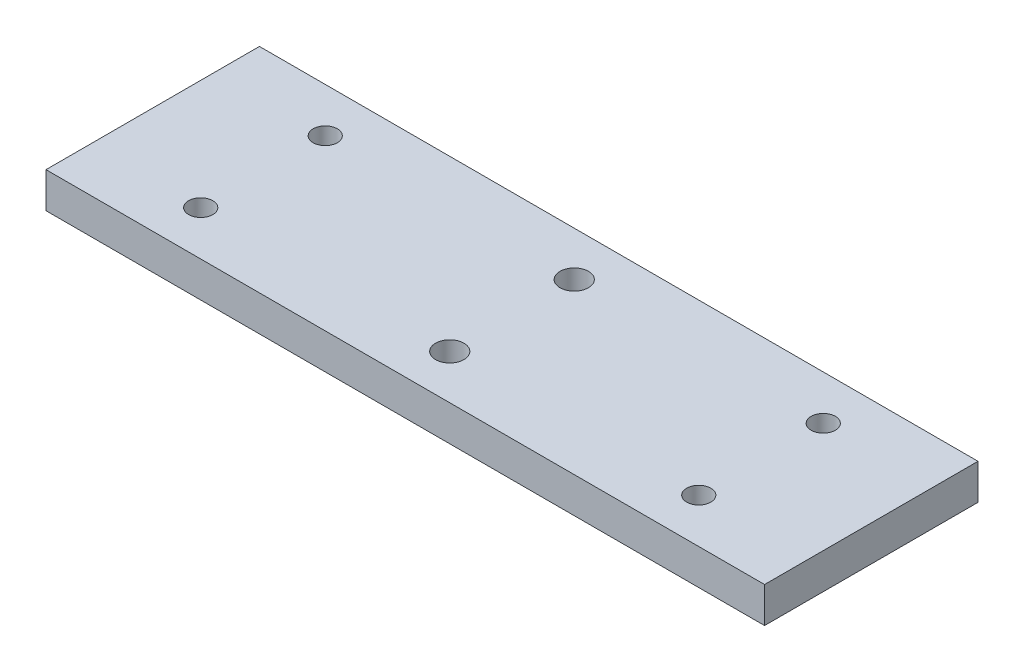
ISO-10303-21;
HEADER;
FILE_DESCRIPTION(('STEP AP214'),'2;1');
FILE_NAME('part.step','',(''),(''),'','','');
FILE_SCHEMA(('AUTOMOTIVE_DESIGN { 1 0 10303 214 1 1 1 1 }'));
ENDSEC;
DATA;
#1=APPLICATION_CONTEXT('core data for automotive mechanical design processes');
#2=APPLICATION_PROTOCOL_DEFINITION('international standard','automotive_design',2000,#1);
#3=PRODUCT_CONTEXT('',#1,'mechanical');
#4=PRODUCT('Part','Part','',(#3));
#5=PRODUCT_RELATED_PRODUCT_CATEGORY('part','',(#4));
#6=PRODUCT_DEFINITION_FORMATION('','',#4);
#7=PRODUCT_DEFINITION_CONTEXT('part definition',#1,'design');
#8=PRODUCT_DEFINITION('design','',#6,#7);
#9=PRODUCT_DEFINITION_SHAPE('','',#8);
#10=(LENGTH_UNIT() NAMED_UNIT(*) SI_UNIT(.MILLI.,.METRE.));
#11=(NAMED_UNIT(*) PLANE_ANGLE_UNIT() SI_UNIT($,.RADIAN.));
#12=(NAMED_UNIT(*) SI_UNIT($,.STERADIAN.) SOLID_ANGLE_UNIT());
#13=UNCERTAINTY_MEASURE_WITH_UNIT(LENGTH_MEASURE(1.E-05),#10,'distance_accuracy_value','');
#14=(GEOMETRIC_REPRESENTATION_CONTEXT(3) GLOBAL_UNCERTAINTY_ASSIGNED_CONTEXT((#13)) GLOBAL_UNIT_ASSIGNED_CONTEXT((#10,
#11,#12)) REPRESENTATION_CONTEXT('',''));
#15=CARTESIAN_POINT('',(0.,0.,0.));
#16=DIRECTION('',(0.,0.,1.));
#17=DIRECTION('',(1.,0.,0.));
#18=AXIS2_PLACEMENT_3D('',#15,#16,#17);
#19=CARTESIAN_POINT('',(0.,-30.,0.));
#20=DIRECTION('',(0.,-1.,0.));
#21=DIRECTION('',(0.,0.,-1.));
#22=AXIS2_PLACEMENT_3D('',#19,#20,#21);
#23=PLANE('',#22);
#24=DIRECTION('',(0.,0.,-1.));
#25=VECTOR('',#24,1.);
#26=CARTESIAN_POINT('',(-640.,-30.,-30.0000000000004));
#27=LINE('',#26,#25);
#28=CARTESIAN_POINT('',(-640.,-30.,-30.0000000000004));
#29=VERTEX_POINT('',#28);
#30=CARTESIAN_POINT('',(-640.,-30.,29.9999999999996));
#31=VERTEX_POINT('',#30);
#32=EDGE_CURVE('E101',#29,#31,#27,.F.);
#33=ORIENTED_EDGE('',*,*,#32,.T.);
#34=DIRECTION('',(-1.,0.,0.));
#35=VECTOR('',#34,1.);
#36=CARTESIAN_POINT('',(-640.,-30.,29.9999999999996));
#37=LINE('',#36,#35);
#38=CARTESIAN_POINT('',(-438.,-30.,29.9999999999997));
#39=VERTEX_POINT('',#38);
#40=EDGE_CURVE('E71',#31,#39,#37,.F.);
#41=ORIENTED_EDGE('',*,*,#40,.T.);
#42=DIRECTION('',(0.,0.,1.));
#43=VECTOR('',#42,1.);
#44=CARTESIAN_POINT('',(-438.,-30.,-30.0000000000003));
#45=LINE('',#44,#43);
#46=CARTESIAN_POINT('',(-438.,-30.,-30.0000000000003));
#47=VERTEX_POINT('',#46);
#48=EDGE_CURVE('E54',#39,#47,#45,.F.);
#49=ORIENTED_EDGE('',*,*,#48,.T.);
#50=DIRECTION('',(1.,0.,0.));
#51=VECTOR('',#50,1.);
#52=CARTESIAN_POINT('',(-640.,-30.,-30.0000000000004));
#53=LINE('',#52,#51);
#54=EDGE_CURVE('E59',#47,#29,#53,.F.);
#55=ORIENTED_EDGE('',*,*,#54,.T.);
#56=EDGE_LOOP('',(#33,#41,#49,#55));
#57=FACE_BOUND('',#56,.T.);
#58=CARTESIAN_POINT('',(-469.,-30.,-17.5));
#59=DIRECTION('',(0.,-1.,0.));
#60=DIRECTION('',(0.,0.,-1.));
#61=AXIS2_PLACEMENT_3D('',#58,#59,#60);
#62=CIRCLE('',#61,3.40000000000001);
#63=CARTESIAN_POINT('',(-469.,-30.,-20.9));
#64=VERTEX_POINT('',#63);
#65=EDGE_CURVE('E68',#64,#64,#62,.T.);
#66=ORIENTED_EDGE('',*,*,#65,.T.);
#67=EDGE_LOOP('',(#66));
#68=FACE_BOUND('',#67,.T.);
#69=CARTESIAN_POINT('',(-469.,-30.,17.5));
#70=DIRECTION('',(0.,-1.,0.));
#71=DIRECTION('',(0.,0.,-1.));
#72=AXIS2_PLACEMENT_3D('',#69,#70,#71);
#73=CIRCLE('',#72,3.40000000000001);
#74=CARTESIAN_POINT('',(-469.,-30.,14.1));
#75=VERTEX_POINT('',#74);
#76=EDGE_CURVE('E104',#75,#75,#73,.T.);
#77=ORIENTED_EDGE('',*,*,#76,.T.);
#78=EDGE_LOOP('',(#77));
#79=FACE_BOUND('',#78,.T.);
#80=CARTESIAN_POINT('',(-609.,-30.,17.5));
#81=DIRECTION('',(0.,-1.,0.));
#82=DIRECTION('',(0.,0.,-1.));
#83=AXIS2_PLACEMENT_3D('',#80,#81,#82);
#84=CIRCLE('',#83,3.39999999999996);
#85=CARTESIAN_POINT('',(-609.,-30.,14.1));
#86=VERTEX_POINT('',#85);
#87=EDGE_CURVE('E107',#86,#86,#84,.T.);
#88=ORIENTED_EDGE('',*,*,#87,.T.);
#89=EDGE_LOOP('',(#88));
#90=FACE_BOUND('',#89,.T.);
#91=CARTESIAN_POINT('',(-609.,-30.,-17.5));
#92=DIRECTION('',(0.,-1.,0.));
#93=DIRECTION('',(0.,0.,-1.));
#94=AXIS2_PLACEMENT_3D('',#91,#92,#93);
#95=CIRCLE('',#94,3.39999999999996);
#96=CARTESIAN_POINT('',(-609.,-30.,-20.9));
#97=VERTEX_POINT('',#96);
#98=EDGE_CURVE('E110',#97,#97,#95,.T.);
#99=ORIENTED_EDGE('',*,*,#98,.T.);
#100=EDGE_LOOP('',(#99));
#101=FACE_BOUND('',#100,.T.);
#102=CARTESIAN_POINT('',(-539.,-30.,17.4999999999993));
#103=DIRECTION('',(0.,-1.,0.));
#104=DIRECTION('',(0.,0.,-1.));
#105=AXIS2_PLACEMENT_3D('',#102,#103,#104);
#106=CIRCLE('',#105,4.);
#107=CARTESIAN_POINT('',(-539.,-30.,13.4999999999993));
#108=VERTEX_POINT('',#107);
#109=EDGE_CURVE('E112',#108,#108,#106,.T.);
#110=ORIENTED_EDGE('',*,*,#109,.T.);
#111=EDGE_LOOP('',(#110));
#112=FACE_BOUND('',#111,.T.);
#113=CARTESIAN_POINT('',(-539.,-30.,-17.5));
#114=DIRECTION('',(0.,-1.,0.));
#115=DIRECTION('',(0.,0.,-1.));
#116=AXIS2_PLACEMENT_3D('',#113,#114,#115);
#117=CIRCLE('',#116,4.);
#118=CARTESIAN_POINT('',(-539.,-30.,-21.5));
#119=VERTEX_POINT('',#118);
#120=EDGE_CURVE('E19',#119,#119,#117,.T.);
#121=ORIENTED_EDGE('',*,*,#120,.T.);
#122=EDGE_LOOP('',(#121));
#123=FACE_BOUND('',#122,.T.);
#124=ADVANCED_FACE('F16',(#57,#68,#79,#90,#101,#112,#123),#23,.F.);
#125=CARTESIAN_POINT('',(-539.,-40.,-17.5));
#126=DIRECTION('',(0.,-1.,0.));
#127=DIRECTION('',(0.,0.,-1.));
#128=AXIS2_PLACEMENT_3D('',#125,#126,#127);
#129=CYLINDRICAL_SURFACE('',#128,4.);
#130=CARTESIAN_POINT('',(-539.,-40.,-17.5));
#131=DIRECTION('',(0.,-1.,0.));
#132=DIRECTION('',(0.,0.,-1.));
#133=AXIS2_PLACEMENT_3D('',#130,#131,#132);
#134=CIRCLE('',#133,4.);
#135=CARTESIAN_POINT('',(-539.,-40.,-21.5));
#136=VERTEX_POINT('',#135);
#137=EDGE_CURVE('E98',#136,#136,#134,.F.);
#138=ORIENTED_EDGE('',*,*,#137,.F.);
#139=EDGE_LOOP('',(#138));
#140=FACE_BOUND('',#139,.T.);
#141=ORIENTED_EDGE('',*,*,#120,.F.);
#142=EDGE_LOOP('',(#141));
#143=FACE_BOUND('',#142,.T.);
#144=ADVANCED_FACE('F120',(#140,#143),#129,.F.);
#145=CARTESIAN_POINT('',(-539.,-40.,17.4999999999993));
#146=DIRECTION('',(0.,-1.,0.));
#147=DIRECTION('',(0.,0.,-1.));
#148=AXIS2_PLACEMENT_3D('',#145,#146,#147);
#149=CYLINDRICAL_SURFACE('',#148,4.);
#150=CARTESIAN_POINT('',(-539.,-40.,17.4999999999993));
#151=DIRECTION('',(0.,-1.,0.));
#152=DIRECTION('',(0.,0.,-1.));
#153=AXIS2_PLACEMENT_3D('',#150,#151,#152);
#154=CIRCLE('',#153,4.);
#155=CARTESIAN_POINT('',(-539.,-40.,13.4999999999993));
#156=VERTEX_POINT('',#155);
#157=EDGE_CURVE('E95',#156,#156,#154,.F.);
#158=ORIENTED_EDGE('',*,*,#157,.F.);
#159=EDGE_LOOP('',(#158));
#160=FACE_BOUND('',#159,.T.);
#161=ORIENTED_EDGE('',*,*,#109,.F.);
#162=EDGE_LOOP('',(#161));
#163=FACE_BOUND('',#162,.T.);
#164=ADVANCED_FACE('F122',(#160,#163),#149,.F.);
#165=CARTESIAN_POINT('',(-609.,-40.,-17.5));
#166=DIRECTION('',(0.,-1.,0.));
#167=DIRECTION('',(0.,0.,-1.));
#168=AXIS2_PLACEMENT_3D('',#165,#166,#167);
#169=CYLINDRICAL_SURFACE('',#168,3.39999999999996);
#170=CARTESIAN_POINT('',(-609.,-40.,-17.5));
#171=DIRECTION('',(0.,-1.,0.));
#172=DIRECTION('',(0.,0.,-1.));
#173=AXIS2_PLACEMENT_3D('',#170,#171,#172);
#174=CIRCLE('',#173,3.39999999999996);
#175=CARTESIAN_POINT('',(-609.,-40.,-20.9));
#176=VERTEX_POINT('',#175);
#177=EDGE_CURVE('E92',#176,#176,#174,.F.);
#178=ORIENTED_EDGE('',*,*,#177,.F.);
#179=EDGE_LOOP('',(#178));
#180=FACE_BOUND('',#179,.T.);
#181=ORIENTED_EDGE('',*,*,#98,.F.);
#182=EDGE_LOOP('',(#181));
#183=FACE_BOUND('',#182,.T.);
#184=ADVANCED_FACE('F129',(#180,#183),#169,.F.);
#185=CARTESIAN_POINT('',(-609.,-40.,17.5));
#186=DIRECTION('',(0.,-1.,0.));
#187=DIRECTION('',(0.,0.,-1.));
#188=AXIS2_PLACEMENT_3D('',#185,#186,#187);
#189=CYLINDRICAL_SURFACE('',#188,3.39999999999996);
#190=CARTESIAN_POINT('',(-609.,-40.,17.5));
#191=DIRECTION('',(0.,-1.,0.));
#192=DIRECTION('',(0.,0.,-1.));
#193=AXIS2_PLACEMENT_3D('',#190,#191,#192);
#194=CIRCLE('',#193,3.39999999999996);
#195=CARTESIAN_POINT('',(-609.,-40.,14.1));
#196=VERTEX_POINT('',#195);
#197=EDGE_CURVE('E89',#196,#196,#194,.F.);
#198=ORIENTED_EDGE('',*,*,#197,.F.);
#199=EDGE_LOOP('',(#198));
#200=FACE_BOUND('',#199,.T.);
#201=ORIENTED_EDGE('',*,*,#87,.F.);
#202=EDGE_LOOP('',(#201));
#203=FACE_BOUND('',#202,.T.);
#204=ADVANCED_FACE('F160',(#200,#203),#189,.F.);
#205=CARTESIAN_POINT('',(-469.,-40.,17.5));
#206=DIRECTION('',(0.,-1.,0.));
#207=DIRECTION('',(0.,0.,-1.));
#208=AXIS2_PLACEMENT_3D('',#205,#206,#207);
#209=CYLINDRICAL_SURFACE('',#208,3.40000000000001);
#210=CARTESIAN_POINT('',(-469.,-40.,17.5));
#211=DIRECTION('',(0.,-1.,0.));
#212=DIRECTION('',(0.,0.,-1.));
#213=AXIS2_PLACEMENT_3D('',#210,#211,#212);
#214=CIRCLE('',#213,3.40000000000001);
#215=CARTESIAN_POINT('',(-469.,-40.,14.1));
#216=VERTEX_POINT('',#215);
#217=EDGE_CURVE('E86',#216,#216,#214,.F.);
#218=ORIENTED_EDGE('',*,*,#217,.F.);
#219=EDGE_LOOP('',(#218));
#220=FACE_BOUND('',#219,.T.);
#221=ORIENTED_EDGE('',*,*,#76,.F.);
#222=EDGE_LOOP('',(#221));
#223=FACE_BOUND('',#222,.T.);
#224=ADVANCED_FACE('F156',(#220,#223),#209,.F.);
#225=CARTESIAN_POINT('',(-469.,-40.,-17.5));
#226=DIRECTION('',(0.,-1.,0.));
#227=DIRECTION('',(0.,0.,-1.));
#228=AXIS2_PLACEMENT_3D('',#225,#226,#227);
#229=CYLINDRICAL_SURFACE('',#228,3.40000000000001);
#230=CARTESIAN_POINT('',(-469.,-40.,-17.5));
#231=DIRECTION('',(0.,-1.,0.));
#232=DIRECTION('',(0.,0.,-1.));
#233=AXIS2_PLACEMENT_3D('',#230,#231,#232);
#234=CIRCLE('',#233,3.40000000000001);
#235=CARTESIAN_POINT('',(-469.,-40.,-20.9));
#236=VERTEX_POINT('',#235);
#237=EDGE_CURVE('E82',#236,#236,#234,.F.);
#238=ORIENTED_EDGE('',*,*,#237,.F.);
#239=EDGE_LOOP('',(#238));
#240=FACE_BOUND('',#239,.T.);
#241=ORIENTED_EDGE('',*,*,#65,.F.);
#242=EDGE_LOOP('',(#241));
#243=FACE_BOUND('',#242,.T.);
#244=ADVANCED_FACE('F153',(#240,#243),#229,.F.);
#245=CARTESIAN_POINT('',(-640.,-40.,-30.0000000000004));
#246=DIRECTION('',(0.,0.,1.));
#247=DIRECTION('',(1.,0.,0.));
#248=AXIS2_PLACEMENT_3D('',#245,#246,#247);
#249=PLANE('',#248);
#250=DIRECTION('',(0.,1.,0.));
#251=VECTOR('',#250,1.);
#252=CARTESIAN_POINT('',(-438.,-40.,-30.0000000000003));
#253=LINE('',#252,#251);
#254=CARTESIAN_POINT('',(-438.,-40.,-30.0000000000003));
#255=VERTEX_POINT('',#254);
#256=EDGE_CURVE('E61',#47,#255,#253,.F.);
#257=ORIENTED_EDGE('',*,*,#256,.T.);
#258=DIRECTION('',(1.,0.,0.));
#259=VECTOR('',#258,1.);
#260=CARTESIAN_POINT('',(0.,-40.,-30.0000000000004));
#261=LINE('',#260,#259);
#262=CARTESIAN_POINT('',(-640.,-40.,-30.0000000000004));
#263=VERTEX_POINT('',#262);
#264=EDGE_CURVE('E85',#263,#255,#261,.T.);
#265=ORIENTED_EDGE('',*,*,#264,.F.);
#266=DIRECTION('',(0.,1.,0.));
#267=VECTOR('',#266,1.);
#268=CARTESIAN_POINT('',(-640.,-40.,-30.0000000000004));
#269=LINE('',#268,#267);
#270=EDGE_CURVE('E64',#263,#29,#269,.T.);
#271=ORIENTED_EDGE('',*,*,#270,.T.);
#272=ORIENTED_EDGE('',*,*,#54,.F.);
#273=EDGE_LOOP('',(#257,#265,#271,#272));
#274=FACE_BOUND('',#273,.T.);
#275=ADVANCED_FACE('F60',(#274),#249,.F.);
#276=CARTESIAN_POINT('',(-438.,-40.,-30.0000000000003));
#277=DIRECTION('',(-1.,0.,0.));
#278=DIRECTION('',(0.,0.,1.));
#279=AXIS2_PLACEMENT_3D('',#276,#277,#278);
#280=PLANE('',#279);
#281=DIRECTION('',(0.,1.,0.));
#282=VECTOR('',#281,1.);
#283=CARTESIAN_POINT('',(-438.,-40.,29.9999999999997));
#284=LINE('',#283,#282);
#285=CARTESIAN_POINT('',(-438.,-40.,29.9999999999997));
#286=VERTEX_POINT('',#285);
#287=EDGE_CURVE('E73',#39,#286,#284,.F.);
#288=ORIENTED_EDGE('',*,*,#287,.T.);
#289=DIRECTION('',(0.,0.,-1.));
#290=VECTOR('',#289,1.);
#291=CARTESIAN_POINT('',(-438.,-40.,0.));
#292=LINE('',#291,#290);
#293=EDGE_CURVE('E77',#255,#286,#292,.F.);
#294=ORIENTED_EDGE('',*,*,#293,.F.);
#295=ORIENTED_EDGE('',*,*,#256,.F.);
#296=ORIENTED_EDGE('',*,*,#48,.F.);
#297=EDGE_LOOP('',(#288,#294,#295,#296));
#298=FACE_BOUND('',#297,.T.);
#299=ADVANCED_FACE('F75',(#298),#280,.F.);
#300=CARTESIAN_POINT('',(-640.,-40.,29.9999999999996));
#301=DIRECTION('',(0.,0.,-1.));
#302=DIRECTION('',(-1.,0.,0.));
#303=AXIS2_PLACEMENT_3D('',#300,#301,#302);
#304=PLANE('',#303);
#305=DIRECTION('',(0.,1.,0.));
#306=VECTOR('',#305,1.);
#307=CARTESIAN_POINT('',(-640.,-40.,29.9999999999996));
#308=LINE('',#307,#306);
#309=CARTESIAN_POINT('',(-640.,-40.,29.9999999999996));
#310=VERTEX_POINT('',#309);
#311=EDGE_CURVE('E34',#31,#310,#308,.F.);
#312=ORIENTED_EDGE('',*,*,#311,.T.);
#313=DIRECTION('',(1.,0.,0.));
#314=VECTOR('',#313,1.);
#315=CARTESIAN_POINT('',(0.,-40.,29.9999999999997));
#316=LINE('',#315,#314);
#317=EDGE_CURVE('E25',#286,#310,#316,.F.);
#318=ORIENTED_EDGE('',*,*,#317,.F.);
#319=ORIENTED_EDGE('',*,*,#287,.F.);
#320=ORIENTED_EDGE('',*,*,#40,.F.);
#321=EDGE_LOOP('',(#312,#318,#319,#320));
#322=FACE_BOUND('',#321,.T.);
#323=ADVANCED_FACE('F141',(#322),#304,.F.);
#324=CARTESIAN_POINT('',(-640.,-40.,-30.0000000000004));
#325=DIRECTION('',(1.,0.,0.));
#326=DIRECTION('',(0.,0.,-1.));
#327=AXIS2_PLACEMENT_3D('',#324,#325,#326);
#328=PLANE('',#327);
#329=ORIENTED_EDGE('',*,*,#270,.F.);
#330=DIRECTION('',(0.,0.,-1.));
#331=VECTOR('',#330,1.);
#332=CARTESIAN_POINT('',(-640.,-40.,0.));
#333=LINE('',#332,#331);
#334=EDGE_CURVE('E11',#310,#263,#333,.T.);
#335=ORIENTED_EDGE('',*,*,#334,.F.);
#336=ORIENTED_EDGE('',*,*,#311,.F.);
#337=ORIENTED_EDGE('',*,*,#32,.F.);
#338=EDGE_LOOP('',(#329,#335,#336,#337));
#339=FACE_BOUND('',#338,.T.);
#340=ADVANCED_FACE('F135',(#339),#328,.F.);
#341=CARTESIAN_POINT('',(0.,-40.,0.));
#342=DIRECTION('',(0.,-1.,0.));
#343=DIRECTION('',(0.,0.,-1.));
#344=AXIS2_PLACEMENT_3D('',#341,#342,#343);
#345=PLANE('',#344);
#346=ORIENTED_EDGE('',*,*,#317,.T.);
#347=ORIENTED_EDGE('',*,*,#334,.T.);
#348=ORIENTED_EDGE('',*,*,#264,.T.);
#349=ORIENTED_EDGE('',*,*,#293,.T.);
#350=EDGE_LOOP('',(#346,#347,#348,#349));
#351=FACE_BOUND('',#350,.T.);
#352=ORIENTED_EDGE('',*,*,#237,.T.);
#353=EDGE_LOOP('',(#352));
#354=FACE_BOUND('',#353,.T.);
#355=ORIENTED_EDGE('',*,*,#217,.T.);
#356=EDGE_LOOP('',(#355));
#357=FACE_BOUND('',#356,.T.);
#358=ORIENTED_EDGE('',*,*,#197,.T.);
#359=EDGE_LOOP('',(#358));
#360=FACE_BOUND('',#359,.T.);
#361=ORIENTED_EDGE('',*,*,#177,.T.);
#362=EDGE_LOOP('',(#361));
#363=FACE_BOUND('',#362,.T.);
#364=ORIENTED_EDGE('',*,*,#157,.T.);
#365=EDGE_LOOP('',(#364));
#366=FACE_BOUND('',#365,.T.);
#367=ORIENTED_EDGE('',*,*,#137,.T.);
#368=EDGE_LOOP('',(#367));
#369=FACE_BOUND('',#368,.T.);
#370=ADVANCED_FACE('F133',(#351,#354,#357,#360,#363,#366,#369),#345,.T.);
#371=CLOSED_SHELL('',(#124,#144,#164,#184,#204,#224,#244,#275,#299,#323,#340,#370));
#372=MANIFOLD_SOLID_BREP('B1',#371);
#373=ADVANCED_BREP_SHAPE_REPRESENTATION('',(#18,#372),#14);
#374=SHAPE_DEFINITION_REPRESENTATION(#9,#373);
ENDSEC;
END-ISO-10303-21;
